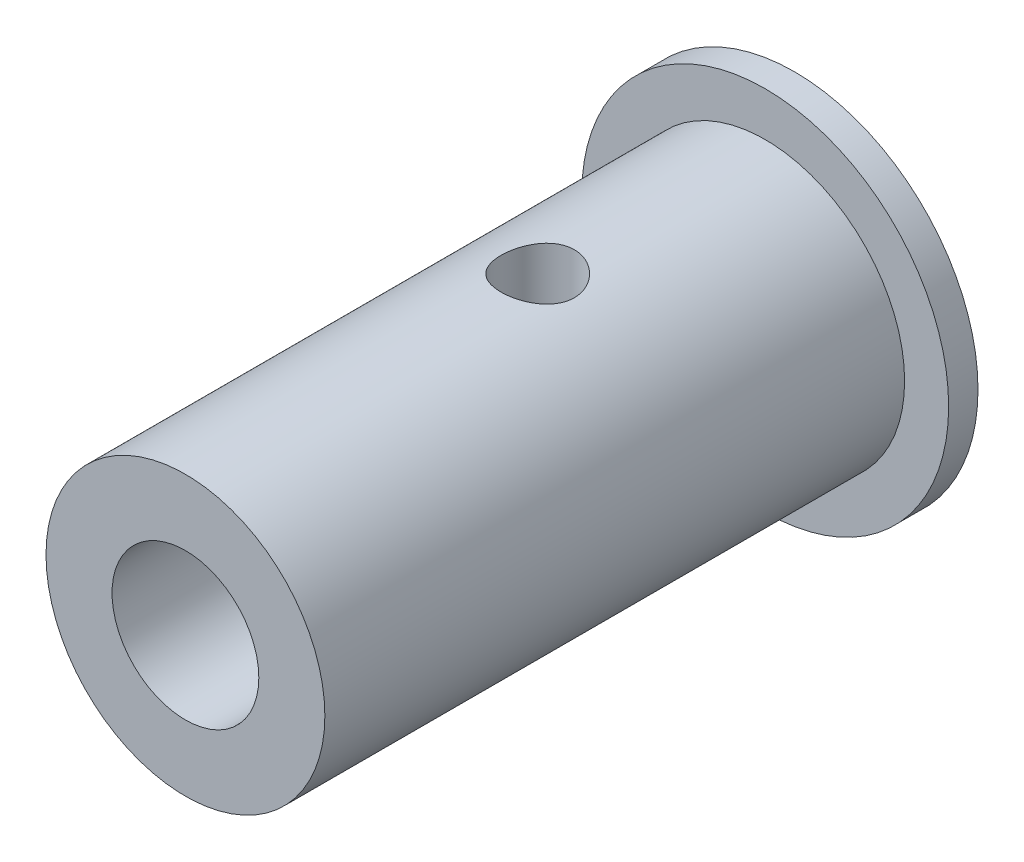
ISO-10303-21;
HEADER;
FILE_DESCRIPTION(('STEP AP214'),'2;1');
FILE_NAME('part.step','',(''),(''),'','','');
FILE_SCHEMA(('AUTOMOTIVE_DESIGN { 1 0 10303 214 1 1 1 1 }'));
ENDSEC;
DATA;
#1=APPLICATION_CONTEXT('core data for automotive mechanical design processes');
#2=APPLICATION_PROTOCOL_DEFINITION('international standard','automotive_design',2000,#1);
#3=PRODUCT_CONTEXT('',#1,'mechanical');
#4=PRODUCT('Part','Part','',(#3));
#5=PRODUCT_RELATED_PRODUCT_CATEGORY('part','',(#4));
#6=PRODUCT_DEFINITION_FORMATION('','',#4);
#7=PRODUCT_DEFINITION_CONTEXT('part definition',#1,'design');
#8=PRODUCT_DEFINITION('design','',#6,#7);
#9=PRODUCT_DEFINITION_SHAPE('','',#8);
#10=(LENGTH_UNIT() NAMED_UNIT(*) SI_UNIT(.MILLI.,.METRE.));
#11=(NAMED_UNIT(*) PLANE_ANGLE_UNIT() SI_UNIT($,.RADIAN.));
#12=(NAMED_UNIT(*) SI_UNIT($,.STERADIAN.) SOLID_ANGLE_UNIT());
#13=UNCERTAINTY_MEASURE_WITH_UNIT(LENGTH_MEASURE(1.E-05),#10,'distance_accuracy_value','');
#14=(GEOMETRIC_REPRESENTATION_CONTEXT(3) GLOBAL_UNCERTAINTY_ASSIGNED_CONTEXT((#13)) GLOBAL_UNIT_ASSIGNED_CONTEXT((#10,
#11,#12)) REPRESENTATION_CONTEXT('',''));
#15=CARTESIAN_POINT('',(0.,0.,0.));
#16=DIRECTION('',(0.,0.,1.));
#17=DIRECTION('',(1.,0.,0.));
#18=AXIS2_PLACEMENT_3D('',#15,#16,#17);
#19=CARTESIAN_POINT('',(0.,0.,41.5));
#20=DIRECTION('',(0.,0.,-1.));
#21=DIRECTION('',(-1.,0.,0.));
#22=AXIS2_PLACEMENT_3D('',#19,#20,#21);
#23=CYLINDRICAL_SURFACE('',#22,5.);
#24=CARTESIAN_POINT('',(0.,0.,0.));
#25=DIRECTION('',(0.,0.,1.));
#26=DIRECTION('',(1.,0.,0.));
#27=AXIS2_PLACEMENT_3D('',#24,#25,#26);
#28=CIRCLE('',#27,5.);
#29=CARTESIAN_POINT('',(5.,0.,0.));
#30=VERTEX_POINT('',#29);
#31=EDGE_CURVE('E51',#30,#30,#28,.T.);
#32=ORIENTED_EDGE('',*,*,#31,.F.);
#33=EDGE_LOOP('',(#32));
#34=FACE_BOUND('',#33,.T.);
#35=CARTESIAN_POINT('',(0.,0.,41.5));
#36=DIRECTION('',(0.,0.,1.));
#37=DIRECTION('',(1.,0.,0.));
#38=AXIS2_PLACEMENT_3D('',#35,#36,#37);
#39=CIRCLE('',#38,5.);
#40=CARTESIAN_POINT('',(5.,0.,41.5));
#41=VERTEX_POINT('',#40);
#42=EDGE_CURVE('E54',#41,#41,#39,.T.);
#43=ORIENTED_EDGE('',*,*,#42,.T.);
#44=EDGE_LOOP('',(#43));
#45=FACE_BOUND('',#44,.T.);
#46=CARTESIAN_POINT('',(0.,5.,15.));
#47=CARTESIAN_POINT('',(0.131426682334307,4.99999177550472,15.000009669056));
#48=CARTESIAN_POINT('',(0.263015634437215,4.99476199135277,15.010425561774));
#49=CARTESIAN_POINT('',(0.522301454622885,4.9743541856102,15.0516318211621));
#50=CARTESIAN_POINT('',(0.649990448564107,4.9591572718767,15.082460880925));
#51=CARTESIAN_POINT('',(0.897333631316205,4.92040690922477,15.1629846227188));
#52=CARTESIAN_POINT('',(1.01701694536277,4.89688595907259,15.2126059877827));
#53=CARTESIAN_POINT('',(1.24618160399671,4.84364443325827,15.3289265262518));
#54=CARTESIAN_POINT('',(1.3556637520377,4.81392434644421,15.3956243531451));
#55=CARTESIAN_POINT('',(1.56876952630998,4.74890645050632,15.5487931316426));
#56=CARTESIAN_POINT('',(1.67163802294309,4.71337997659091,15.6362162002298));
#57=CARTESIAN_POINT('',(1.86194861703333,4.64149925776731,15.8263036959853));
#58=CARTESIAN_POINT('',(1.94937895911556,4.60514440566897,15.9289796288401));
#59=CARTESIAN_POINT('',(2.11312999967247,4.53247377945621,16.1562083744453));
#60=CARTESIAN_POINT('',(2.18806333849064,4.49637967412567,16.281840246035));
#61=CARTESIAN_POINT('',(2.31542056761491,4.43214946943555,16.5459183397954));
#62=CARTESIAN_POINT('',(2.36786053751683,4.40400769020792,16.6843553217626));
#63=CARTESIAN_POINT('',(2.44533110537653,4.36144667591402,16.9616627635964));
#64=CARTESIAN_POINT('',(2.47181464267578,4.34630678958452,17.1000111301796));
#65=CARTESIAN_POINT('',(2.50106748329741,4.3295472487215,17.3799470944376));
#66=CARTESIAN_POINT('',(2.50386022093906,4.3279142335843,17.5215313521751));
#67=CARTESIAN_POINT('',(2.48671821792512,4.33777325642937,17.7857150607909));
#68=CARTESIAN_POINT('',(2.46946139884055,4.34771909154984,17.9085600780583));
#69=CARTESIAN_POINT('',(2.41734962264384,4.37690571834675,18.1493047734319));
#70=CARTESIAN_POINT('',(2.38248905974454,4.39614947079454,18.2672028632631));
#71=CARTESIAN_POINT('',(2.29552445096459,4.44218691031839,18.4980728314143));
#72=CARTESIAN_POINT('',(2.24303766778988,4.46914601659993,18.6108659969645));
#73=CARTESIAN_POINT('',(2.12260421917012,4.52758510703513,18.826585731475));
#74=CARTESIAN_POINT('',(2.0546506095312,4.55906711950477,18.9295078390002));
#75=CARTESIAN_POINT('',(1.89516513728194,4.62782894758213,19.1363031318581));
#76=CARTESIAN_POINT('',(1.8017361459232,4.66533775591865,19.2386421839404));
#77=CARTESIAN_POINT('',(1.59888894685345,4.73869058251019,19.4268385464772));
#78=CARTESIAN_POINT('',(1.48946314143572,4.77453379897003,19.5126879800847));
#79=CARTESIAN_POINT('',(1.25129126457962,4.84254968207409,19.6692141525743));
#80=CARTESIAN_POINT('',(1.12188397899853,4.87447460405015,19.7390011811144));
#81=CARTESIAN_POINT('',(0.851165538721987,4.92894702803108,19.8552425726075));
#82=CARTESIAN_POINT('',(0.709863940663165,4.95150197358893,19.9017154625379));
#83=CARTESIAN_POINT('',(0.431916229151784,4.98310834353579,19.9661885092917));
#84=CARTESIAN_POINT('',(0.295853826370909,4.9931234575324,19.986228089367));
#85=CARTESIAN_POINT('',(0.0219489998732911,5.00182533647794,20.0036618278362));
#86=CARTESIAN_POINT('',(-0.115892549675106,5.00051746803426,20.0010667140985));
#87=CARTESIAN_POINT('',(-0.378082429964653,4.98727980633468,19.9744832789533));
#88=CARTESIAN_POINT('',(-0.502648520123704,4.97618114219992,19.9521686681756));
#89=CARTESIAN_POINT('',(-0.74601723075597,4.94555428287529,19.8894048202616));
#90=CARTESIAN_POINT('',(-0.864819214231881,4.92602515837625,19.8489535838641));
#91=CARTESIAN_POINT('',(-1.09722152111964,4.87960628532329,19.7500038339196));
#92=CARTESIAN_POINT('',(-1.2105759924983,4.85252204417873,19.6910223747177));
#93=CARTESIAN_POINT('',(-1.42615340426438,4.79359935799751,19.5572311608752));
#94=CARTESIAN_POINT('',(-1.52837157450203,4.76175888940534,19.4824146634801));
#95=CARTESIAN_POINT('',(-1.72941922315487,4.69270553315087,19.3105989367091));
#96=CARTESIAN_POINT('',(-1.82693019428495,4.65527212009488,19.2121428290248));
#97=CARTESIAN_POINT('',(-2.00464080257219,4.58155978921587,19.0001871219506));
#98=CARTESIAN_POINT('',(-2.08482846428685,4.54528168472407,18.8866772029301));
#99=CARTESIAN_POINT('',(-2.22926978618994,4.4762798054528,18.6408908645154));
#100=CARTESIAN_POINT('',(-2.29256373922243,4.44381323981254,18.5079718347089));
#101=CARTESIAN_POINT('',(-2.39520706511458,4.38935180726746,18.2312248311175));
#102=CARTESIAN_POINT('',(-2.43458729077055,4.36734345549014,18.087411184));
#103=CARTESIAN_POINT('',(-2.48465421767005,4.33903752569352,17.8077244426371));
#104=CARTESIAN_POINT('',(-2.4977324874436,4.33143458674097,17.672414365881));
#105=CARTESIAN_POINT('',(-2.50172288950898,4.32913386592579,17.4013823326193));
#106=CARTESIAN_POINT('',(-2.49264462983266,4.33443049025111,17.2656605801264));
#107=CARTESIAN_POINT('',(-2.45481530197331,4.35594655164663,17.0112912443832));
#108=CARTESIAN_POINT('',(-2.42802074302696,4.37107736338133,16.8922488182792));
#109=CARTESIAN_POINT('',(-2.35793843840543,4.40927540337603,16.6604797078));
#110=CARTESIAN_POINT('',(-2.31464538728732,4.43234518434965,16.5477550684335));
#111=CARTESIAN_POINT('',(-2.20953919315538,4.48571326433413,16.3234378472803));
#112=CARTESIAN_POINT('',(-2.14667719009403,4.5163930799845,16.212430148265));
#113=CARTESIAN_POINT('',(-2.0053780838799,4.58088327077455,16.00181375676));
#114=CARTESIAN_POINT('',(-1.92693287765888,4.61469526970767,15.9022110373713));
#115=CARTESIAN_POINT('',(-1.74550556946065,4.68655816327011,15.7046446362504));
#116=CARTESIAN_POINT('',(-1.6407002246921,4.7246249151498,15.6083506358286));
#117=CARTESIAN_POINT('',(-1.41539785420684,4.79694347383545,15.434344150572));
#118=CARTESIAN_POINT('',(-1.29489242426332,4.83119321905446,15.3566416813941));
#119=CARTESIAN_POINT('',(-1.03978808878536,4.89245149457782,15.2219030205159));
#120=CARTESIAN_POINT('',(-0.905095560782285,4.91940711437488,15.1650168322156));
#121=CARTESIAN_POINT('',(-0.696328709257349,4.95177960923351,15.0978161412076));
#122=CARTESIAN_POINT('',(-0.625670413494087,4.96122314081874,15.0784446019982));
#123=CARTESIAN_POINT('',(-0.482623997839256,4.97717127275101,15.0459340516294));
#124=CARTESIAN_POINT('',(-0.4102369630924,4.98367766823159,15.0327912333237));
#125=CARTESIAN_POINT('',(-0.28151868462167,4.9923820076613,15.0152625277154));
#126=CARTESIAN_POINT('',(-0.225408499555444,4.99523288466454,15.0095450634687));
#127=CARTESIAN_POINT('',(-0.112875528456288,4.99904367329659,15.0019116705343));
#128=CARTESIAN_POINT('',(-0.0564527338382165,5.00000353273198,14.9999958467745));
#129=CARTESIAN_POINT('',(0.,5.,15.));
#130=B_SPLINE_CURVE_WITH_KNOTS('',3,(#46,#47,#48,#49,#50,#51,#52,#53,#54,#55,#56,#57,#58,#59,
#60,#61,#62,#63,#64,#65,#66,#67,#68,#69,#70,#71,#72,#73,#74,#75,#76,#77,#78,#79,#80,#81,#82,#83,
#84,#85,#86,#87,#88,#89,#90,#91,#92,#93,#94,#95,#96,#97,#98,#99,#100,#101,#102,#103,#104,#105,
#106,#107,#108,#109,#110,#111,#112,#113,#114,#115,#116,#117,#118,#119,#120,#121,#122,#123,#124,
#125,#126,#127,#128,#129),.UNSPECIFIED.,.T.,.F.,(4,2,2,2,2,2,2,2,2,2,2,2,2,2,2,2,2,2,2,2,2,2,2,
2,2,2,2,2,2,2,2,2,2,2,2,2,2,2,2,2,2,4),(0.,0.394060643550731,0.788870374272994,1.18215538873075,
1.57540940145392,1.99245439679522,2.40981559413509,2.85954316076881,3.30894869745702,
3.73145030350574,4.15353393322551,4.52514281023301,4.89687009814196,5.27725600421218,
5.65781303150554,6.08662353334696,6.51563836496716,6.96457555536102,7.41315542280699,
7.82458226178364,8.2358141127869,8.61517266265305,8.99457304077329,9.38482140069746,
9.77523626870848,10.2039902661037,10.6330397153795,11.0828670540368,11.53211279863,
11.9382326875699,12.3441764966107,12.7114482562151,13.0788382197025,13.4709114195009,
13.8631890285845,14.303131068923,14.7433095845248,15.1866003415819,15.407934939208,
15.6291340766843,15.7983933645035,15.9676573239323),.UNSPECIFIED.);
#131=CARTESIAN_POINT('',(0.,5.,15.));
#132=VERTEX_POINT('',#131);
#133=EDGE_CURVE('E55',#132,#132,#130,.T.);
#134=ORIENTED_EDGE('',*,*,#133,.F.);
#135=EDGE_LOOP('',(#134));
#136=FACE_BOUND('',#135,.T.);
#137=ADVANCED_FACE('F37',(#34,#45,#136),#23,.F.);
#138=CARTESIAN_POINT('',(0.,0.,41.5));
#139=DIRECTION('',(0.,0.,-1.));
#140=DIRECTION('',(-1.,0.,0.));
#141=AXIS2_PLACEMENT_3D('',#138,#139,#140);
#142=CYLINDRICAL_SURFACE('',#141,9.5);
#143=CARTESIAN_POINT('',(0.,0.,2.));
#144=DIRECTION('',(0.,0.,1.));
#145=DIRECTION('',(1.,0.,0.));
#146=AXIS2_PLACEMENT_3D('',#143,#144,#145);
#147=CIRCLE('',#146,9.5);
#148=CARTESIAN_POINT('',(9.5,0.,2.));
#149=VERTEX_POINT('',#148);
#150=EDGE_CURVE('E45',#149,#149,#147,.T.);
#151=ORIENTED_EDGE('',*,*,#150,.T.);
#152=EDGE_LOOP('',(#151));
#153=FACE_BOUND('',#152,.T.);
#154=CARTESIAN_POINT('',(0.,0.,41.5));
#155=DIRECTION('',(0.,0.,1.));
#156=DIRECTION('',(1.,0.,0.));
#157=AXIS2_PLACEMENT_3D('',#154,#155,#156);
#158=CIRCLE('',#157,9.5);
#159=CARTESIAN_POINT('',(9.5,0.,41.5));
#160=VERTEX_POINT('',#159);
#161=EDGE_CURVE('E56',#160,#160,#158,.T.);
#162=ORIENTED_EDGE('',*,*,#161,.F.);
#163=EDGE_LOOP('',(#162));
#164=FACE_BOUND('',#163,.T.);
#165=CARTESIAN_POINT('',(0.,9.5,15.));
#166=CARTESIAN_POINT('',(0.137884663200169,9.4999978589319,15.0000034083413));
#167=CARTESIAN_POINT('',(0.275806169982056,9.49696845553717,15.0114455814866));
#168=CARTESIAN_POINT('',(0.547680422104073,9.48517762614523,15.0568336387256));
#169=CARTESIAN_POINT('',(0.681631149673867,9.47641333641575,15.0907907658402));
#170=CARTESIAN_POINT('',(0.941599795218328,9.45412076326045,15.1800315753982));
#171=CARTESIAN_POINT('',(1.06762755548515,9.44059853395072,15.2352881643907));
#172=CARTESIAN_POINT('',(1.30862652881559,9.41022151532826,15.3654600210638));
#173=CARTESIAN_POINT('',(1.42359708156079,9.39336652717205,15.4403764618039));
#174=CARTESIAN_POINT('',(1.64181993629425,9.35771941636593,15.6095316156977));
#175=CARTESIAN_POINT('',(1.74478634632153,9.33889486727958,15.7041323275655));
#176=CARTESIAN_POINT('',(1.93359084586557,9.30164002957558,15.9091965586661));
#177=CARTESIAN_POINT('',(2.01942679084604,9.28320979057852,16.0196620610143));
#178=CARTESIAN_POINT('',(2.17291708512181,9.24849966110085,16.2555887683764));
#179=CARTESIAN_POINT('',(2.24024449868174,9.23226073792112,16.3812692522939));
#180=CARTESIAN_POINT('',(2.35270147526438,9.20424780640168,16.6426621042234));
#181=CARTESIAN_POINT('',(2.39783501276008,9.19247299871599,16.7783726710402));
#182=CARTESIAN_POINT('',(2.46363395134783,9.17505594709916,17.0528119281065));
#183=CARTESIAN_POINT('',(2.48481677617339,9.16928424369479,17.1914081478458));
#184=CARTESIAN_POINT('',(2.50372582423423,9.16413995150101,17.470298005673));
#185=CARTESIAN_POINT('',(2.50145630672462,9.16476620075867,17.6105913309214));
#186=CARTESIAN_POINT('',(2.47393631594875,9.1722310773399,17.8848702294473));
#187=CARTESIAN_POINT('',(2.44930986906015,9.1789010040012,18.0189237337372));
#188=CARTESIAN_POINT('',(2.37877367007175,9.19743185586801,18.2809260036759));
#189=CARTESIAN_POINT('',(2.33286225663582,9.2092931862694,18.4088742919397));
#190=CARTESIAN_POINT('',(2.22054589835919,9.23702010881477,18.6566707870853));
#191=CARTESIAN_POINT('',(2.1539205316978,9.25292841794966,18.7764141040657));
#192=CARTESIAN_POINT('',(2.00222137020021,9.28693362281546,19.0032413591449));
#193=CARTESIAN_POINT('',(1.91714402987704,9.30503093886097,19.1103228581979));
#194=CARTESIAN_POINT('',(1.72775627146103,9.3420790135668,19.3123544924553));
#195=CARTESIAN_POINT('',(1.62292126601543,9.36103863220119,19.4068119219798));
#196=CARTESIAN_POINT('',(1.3986680904507,9.39715951587145,19.5769046543978));
#197=CARTESIAN_POINT('',(1.27924937519246,9.41432071363776,19.6525392533726));
#198=CARTESIAN_POINT('',(1.02846858783735,9.44501219877018,19.7830484299616));
#199=CARTESIAN_POINT('',(0.897059143717851,9.45852716922197,19.8378358168365));
#200=CARTESIAN_POINT('',(0.626458525351713,9.48029259145042,19.924400413796));
#201=CARTESIAN_POINT('',(0.487269012444905,9.48854416252685,19.9561825163139));
#202=CARTESIAN_POINT('',(0.209265832527545,9.49868456798611,19.9950653206345));
#203=CARTESIAN_POINT('',(0.0705520479839296,9.50074610556025,20.0028361270028));
#204=CARTESIAN_POINT('',(-0.206196087317413,9.49876969604928,19.9953236038743));
#205=CARTESIAN_POINT('',(-0.344230504932652,9.49473236171185,19.9800425903715));
#206=CARTESIAN_POINT('',(-0.613323515414331,9.48112321375656,19.9274104543839));
#207=CARTESIAN_POINT('',(-0.744460020527066,9.47164474240174,19.8904313299651));
#208=CARTESIAN_POINT('',(-0.998656954500423,9.44822690666909,19.7958831294564));
#209=CARTESIAN_POINT('',(-1.12171651848974,9.43428706550801,19.7383118526211));
#210=CARTESIAN_POINT('',(-1.35888360619122,9.40308612567744,19.6029586778668));
#211=CARTESIAN_POINT('',(-1.47277384906795,9.38576639011377,19.5248099104279));
#212=CARTESIAN_POINT('',(-1.68605972580165,9.34980860657983,19.3509829696095));
#213=CARTESIAN_POINT('',(-1.78545256772039,9.33117030570127,19.2553014277176));
#214=CARTESIAN_POINT('',(-1.96973268881778,9.29404354754289,19.0460009892981));
#215=CARTESIAN_POINT('',(-2.05414772804201,9.27557319869389,18.9319623366582));
#216=CARTESIAN_POINT('',(-2.20265077284399,9.24143699546797,18.690949503871));
#217=CARTESIAN_POINT('',(-2.26673964265903,9.22577102186569,18.5639758740025));
#218=CARTESIAN_POINT('',(-2.37228864024204,9.1991961819113,18.3013437654356));
#219=CARTESIAN_POINT('',(-2.41388084425638,9.18825962723044,18.165741318844));
#220=CARTESIAN_POINT('',(-2.47357685539613,9.17237100532095,17.8891317727534));
#221=CARTESIAN_POINT('',(-2.49168647462762,9.16741745727661,17.7481260195098));
#222=CARTESIAN_POINT('',(-2.5035754058712,9.16417710271858,17.4695408222871));
#223=CARTESIAN_POINT('',(-2.49811278703346,9.16568256903698,17.3319956546761));
#224=CARTESIAN_POINT('',(-2.46476570057895,9.17470557273123,17.0598619958131));
#225=CARTESIAN_POINT('',(-2.43688178162009,9.18222296299295,16.9252734322947));
#226=CARTESIAN_POINT('',(-2.35991776153104,9.20230081361892,16.6637995485075));
#227=CARTESIAN_POINT('',(-2.31099432245761,9.21482395306799,16.5368650489145));
#228=CARTESIAN_POINT('',(-2.19346205912632,9.2435040513402,16.2929108362654));
#229=CARTESIAN_POINT('',(-2.12485022160876,9.25966156631347,16.1758926444288));
#230=CARTESIAN_POINT('',(-1.96757430903026,9.29436941418334,15.9514645874175));
#231=CARTESIAN_POINT('',(-1.87839103794925,9.31297513141964,15.8444270824267));
#232=CARTESIAN_POINT('',(-1.68349652387402,9.35016921749174,15.6465905866393));
#233=CARTESIAN_POINT('',(-1.57778128982408,9.36875758104519,15.5557955283823));
#234=CARTESIAN_POINT('',(-1.35018708630133,9.40428175818212,15.3911797536443));
#235=CARTESIAN_POINT('',(-1.22801920680846,9.42117547738052,15.3177486402598));
#236=CARTESIAN_POINT('',(-0.97263387916611,9.45095016006557,15.1925825494064));
#237=CARTESIAN_POINT('',(-0.83942377102118,9.46383376250233,15.1408332958938));
#238=CARTESIAN_POINT('',(-0.588875796526841,9.48241870918101,15.0674519098479));
#239=CARTESIAN_POINT('',(-0.472643351989962,9.4889642500444,15.0422152994653));
#240=CARTESIAN_POINT('',(-0.237616231690472,9.49775561739774,15.0084886572238));
#241=CARTESIAN_POINT('',(-0.11882179603581,9.50000184506058,14.9999970628696));
#242=CARTESIAN_POINT('',(0.,9.5,15.));
#243=B_SPLINE_CURVE_WITH_KNOTS('',3,(#165,#166,#167,#168,#169,#170,#171,#172,#173,#174,#175,
#176,#177,#178,#179,#180,#181,#182,#183,#184,#185,#186,#187,#188,#189,#190,#191,#192,#193,#194,
#195,#196,#197,#198,#199,#200,#201,#202,#203,#204,#205,#206,#207,#208,#209,#210,#211,#212,#213,
#214,#215,#216,#217,#218,#219,#220,#221,#222,#223,#224,#225,#226,#227,#228,#229,#230,#231,#232,
#233,#234,#235,#236,#237,#238,#239,#240,#241,#242),.UNSPECIFIED.,.T.,.F.,(4,2,2,2,2,2,2,2,2,2,2,
2,2,2,2,2,2,2,2,2,2,2,2,2,2,2,2,2,2,2,2,2,2,2,2,2,2,2,4),(0.,0.413218307292529,0.82664311398427,
1.23954376015726,1.65246904879306,2.07379267437497,2.49516901176602,2.92356960617624,
3.35189345476611,3.77077570910304,4.18958189022737,4.59704611478664,5.00454214813609,
5.41653210536598,5.82860129537587,6.2537447574079,6.67890411617069,7.10582259900532,
7.53265026425717,7.9474532588793,8.36221458142333,8.77006471802041,9.17795845581901,
9.59368485631319,10.0094912128133,10.4366941512347,10.8638789232118,11.2885277256592,
11.7130714044454,12.1240655288083,12.5350495962919,12.9430250337226,13.3510629440972,
13.7708169031548,14.1906723537905,14.6192052314105,15.0474555038948,15.4035786755636,
15.7596686154295),.UNSPECIFIED.);
#244=CARTESIAN_POINT('',(0.,9.5,15.));
#245=VERTEX_POINT('',#244);
#246=EDGE_CURVE('E68',#245,#245,#243,.T.);
#247=ORIENTED_EDGE('',*,*,#246,.T.);
#248=EDGE_LOOP('',(#247));
#249=FACE_BOUND('',#248,.T.);
#250=ADVANCED_FACE('F86',(#153,#164,#249),#142,.T.);
#251=CARTESIAN_POINT('',(0.,0.,2.));
#252=DIRECTION('',(0.,0.,-1.));
#253=DIRECTION('',(-1.,0.,0.));
#254=AXIS2_PLACEMENT_3D('',#251,#252,#253);
#255=CYLINDRICAL_SURFACE('',#254,12.5);
#256=CARTESIAN_POINT('',(0.,0.,2.));
#257=DIRECTION('',(0.,0.,1.));
#258=DIRECTION('',(1.,0.,0.));
#259=AXIS2_PLACEMENT_3D('',#256,#257,#258);
#260=CIRCLE('',#259,12.5);
#261=CARTESIAN_POINT('',(12.5,0.,2.));
#262=VERTEX_POINT('',#261);
#263=EDGE_CURVE('E10',#262,#262,#260,.T.);
#264=ORIENTED_EDGE('',*,*,#263,.F.);
#265=EDGE_LOOP('',(#264));
#266=FACE_BOUND('',#265,.T.);
#267=CARTESIAN_POINT('',(0.,0.,0.));
#268=DIRECTION('',(0.,0.,1.));
#269=DIRECTION('',(1.,0.,0.));
#270=AXIS2_PLACEMENT_3D('',#267,#268,#269);
#271=CIRCLE('',#270,12.5);
#272=CARTESIAN_POINT('',(12.5,0.,0.));
#273=VERTEX_POINT('',#272);
#274=EDGE_CURVE('E41',#273,#273,#271,.T.);
#275=ORIENTED_EDGE('',*,*,#274,.T.);
#276=EDGE_LOOP('',(#275));
#277=FACE_BOUND('',#276,.T.);
#278=ADVANCED_FACE('F39',(#266,#277),#255,.T.);
#279=CARTESIAN_POINT('',(0.,0.,2.));
#280=DIRECTION('',(0.,0.,1.));
#281=DIRECTION('',(1.,0.,0.));
#282=AXIS2_PLACEMENT_3D('',#279,#280,#281);
#283=PLANE('',#282);
#284=ORIENTED_EDGE('',*,*,#150,.F.);
#285=EDGE_LOOP('',(#284));
#286=FACE_BOUND('',#285,.T.);
#287=ORIENTED_EDGE('',*,*,#263,.T.);
#288=EDGE_LOOP('',(#287));
#289=FACE_BOUND('',#288,.T.);
#290=ADVANCED_FACE('F93',(#286,#289),#283,.T.);
#291=CARTESIAN_POINT('',(0.,0.,0.));
#292=DIRECTION('',(0.,0.,1.));
#293=DIRECTION('',(1.,0.,0.));
#294=AXIS2_PLACEMENT_3D('',#291,#292,#293);
#295=PLANE('',#294);
#296=ORIENTED_EDGE('',*,*,#274,.F.);
#297=EDGE_LOOP('',(#296));
#298=FACE_BOUND('',#297,.T.);
#299=ORIENTED_EDGE('',*,*,#31,.T.);
#300=EDGE_LOOP('',(#299));
#301=FACE_BOUND('',#300,.T.);
#302=ADVANCED_FACE('F84',(#298,#301),#295,.F.);
#303=CARTESIAN_POINT('',(0.,0.,41.5));
#304=DIRECTION('',(0.,0.,1.));
#305=DIRECTION('',(1.,0.,0.));
#306=AXIS2_PLACEMENT_3D('',#303,#304,#305);
#307=PLANE('',#306);
#308=ORIENTED_EDGE('',*,*,#42,.F.);
#309=EDGE_LOOP('',(#308));
#310=FACE_BOUND('',#309,.T.);
#311=ORIENTED_EDGE('',*,*,#161,.T.);
#312=EDGE_LOOP('',(#311));
#313=FACE_BOUND('',#312,.T.);
#314=ADVANCED_FACE('F79',(#310,#313),#307,.T.);
#315=CARTESIAN_POINT('',(0.,12.501,17.5));
#316=DIRECTION('',(0.,-1.,0.));
#317=DIRECTION('',(0.,0.,-1.));
#318=AXIS2_PLACEMENT_3D('',#315,#316,#317);
#319=CYLINDRICAL_SURFACE('',#318,2.5);
#320=ORIENTED_EDGE('',*,*,#133,.T.);
#321=EDGE_LOOP('',(#320));
#322=FACE_BOUND('',#321,.T.);
#323=ORIENTED_EDGE('',*,*,#246,.F.);
#324=EDGE_LOOP('',(#323));
#325=FACE_BOUND('',#324,.T.);
#326=ADVANCED_FACE('F73',(#322,#325),#319,.F.);
#327=CLOSED_SHELL('',(#137,#250,#278,#290,#302,#314,#326));
#328=MANIFOLD_SOLID_BREP('B2',#327);
#329=ADVANCED_BREP_SHAPE_REPRESENTATION('',(#18,#328),#14);
#330=SHAPE_DEFINITION_REPRESENTATION(#9,#329);
ENDSEC;
END-ISO-10303-21;
